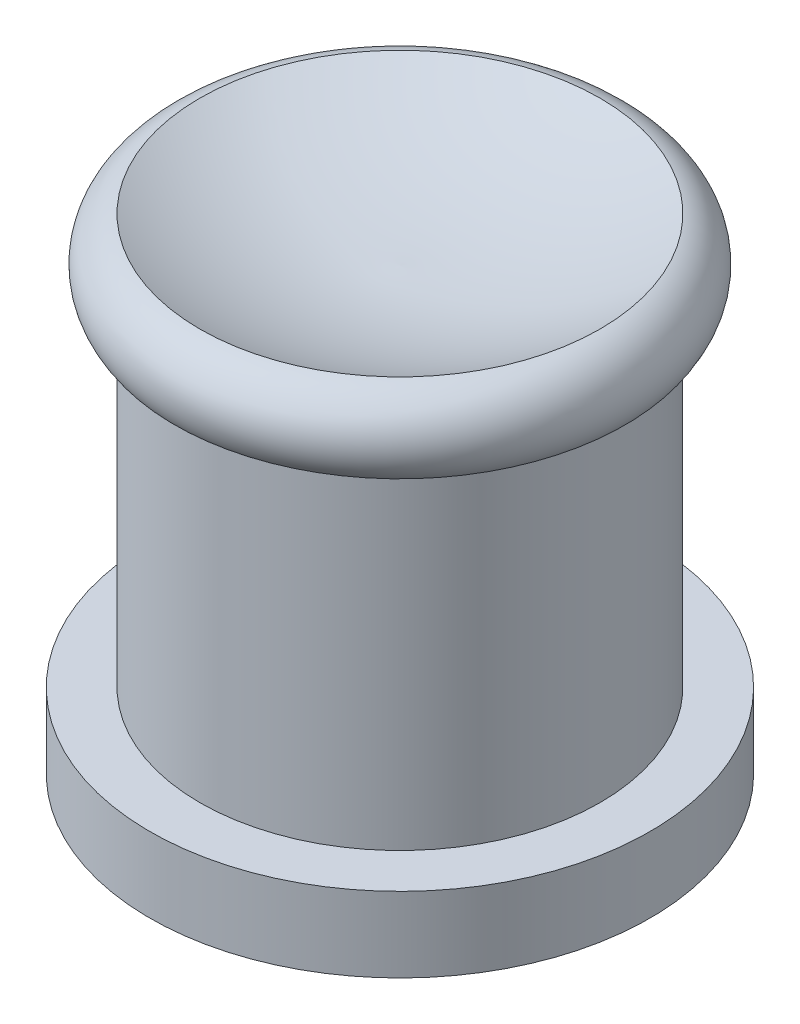
ISO-10303-21;
HEADER;
FILE_DESCRIPTION(('STEP AP214'),'2;1');
FILE_NAME('part.step','',(''),(''),'','','');
FILE_SCHEMA(('AUTOMOTIVE_DESIGN { 1 0 10303 214 1 1 1 1 }'));
ENDSEC;
DATA;
#1=APPLICATION_CONTEXT('core data for automotive mechanical design processes');
#2=APPLICATION_PROTOCOL_DEFINITION('international standard','automotive_design',2000,#1);
#3=PRODUCT_CONTEXT('',#1,'mechanical');
#4=PRODUCT('Part','Part','',(#3));
#5=PRODUCT_RELATED_PRODUCT_CATEGORY('part','',(#4));
#6=PRODUCT_DEFINITION_FORMATION('','',#4);
#7=PRODUCT_DEFINITION_CONTEXT('part definition',#1,'design');
#8=PRODUCT_DEFINITION('design','',#6,#7);
#9=PRODUCT_DEFINITION_SHAPE('','',#8);
#10=(LENGTH_UNIT() NAMED_UNIT(*) SI_UNIT(.MILLI.,.METRE.));
#11=(NAMED_UNIT(*) PLANE_ANGLE_UNIT() SI_UNIT($,.RADIAN.));
#12=(NAMED_UNIT(*) SI_UNIT($,.STERADIAN.) SOLID_ANGLE_UNIT());
#13=UNCERTAINTY_MEASURE_WITH_UNIT(LENGTH_MEASURE(1.E-05),#10,'distance_accuracy_value','');
#14=(GEOMETRIC_REPRESENTATION_CONTEXT(3) GLOBAL_UNCERTAINTY_ASSIGNED_CONTEXT((#13)) GLOBAL_UNIT_ASSIGNED_CONTEXT((#10,
#11,#12)) REPRESENTATION_CONTEXT('',''));
#15=CARTESIAN_POINT('',(0.,0.,0.));
#16=DIRECTION('',(0.,0.,1.));
#17=DIRECTION('',(1.,0.,0.));
#18=AXIS2_PLACEMENT_3D('',#15,#16,#17);
#19=CARTESIAN_POINT('',(0.,0.,0.));
#20=DIRECTION('',(0.,1.,0.));
#21=DIRECTION('',(-1.,0.,0.));
#22=AXIS2_PLACEMENT_3D('',#19,#20,#21);
#23=PLANE('',#22);
#24=CARTESIAN_POINT('',(0.,0.,0.));
#25=DIRECTION('',(0.,1.,0.));
#26=DIRECTION('',(-1.,0.,0.));
#27=AXIS2_PLACEMENT_3D('',#24,#25,#26);
#28=CIRCLE('',#27,0.5);
#29=CARTESIAN_POINT('',(-0.5,0.,0.));
#30=VERTEX_POINT('',#29);
#31=EDGE_CURVE('E11',#30,#30,#28,.T.);
#32=ORIENTED_EDGE('',*,*,#31,.F.);
#33=EDGE_LOOP('',(#32));
#34=FACE_BOUND('',#33,.T.);
#35=ADVANCED_FACE('F32',(#34),#23,.F.);
#36=CARTESIAN_POINT('',(0.,0.88,0.));
#37=DIRECTION('',(0.,1.,0.));
#38=DIRECTION('',(-1.,0.,0.));
#39=AXIS2_PLACEMENT_3D('',#36,#37,#38);
#40=CYLINDRICAL_SURFACE('',#39,0.5);
#41=CARTESIAN_POINT('',(0.,0.15,0.));
#42=DIRECTION('',(0.,1.,0.));
#43=DIRECTION('',(-1.,0.,0.));
#44=AXIS2_PLACEMENT_3D('',#41,#42,#43);
#45=CIRCLE('',#44,0.5);
#46=CARTESIAN_POINT('',(-0.5,0.15,0.));
#47=VERTEX_POINT('',#46);
#48=EDGE_CURVE('E38',#47,#47,#45,.T.);
#49=ORIENTED_EDGE('',*,*,#48,.F.);
#50=EDGE_LOOP('',(#49));
#51=FACE_BOUND('',#50,.T.);
#52=ORIENTED_EDGE('',*,*,#31,.T.);
#53=EDGE_LOOP('',(#52));
#54=FACE_BOUND('',#53,.T.);
#55=ADVANCED_FACE('F65',(#51,#54),#40,.T.);
#56=CARTESIAN_POINT('',(0.5,0.15,0.));
#57=DIRECTION('',(0.,-1.,0.));
#58=DIRECTION('',(1.,0.,0.));
#59=AXIS2_PLACEMENT_3D('',#56,#57,#58);
#60=PLANE('',#59);
#61=CARTESIAN_POINT('',(0.,0.15,0.));
#62=DIRECTION('',(0.,1.,0.));
#63=DIRECTION('',(-1.,0.,0.));
#64=AXIS2_PLACEMENT_3D('',#61,#62,#63);
#65=CIRCLE('',#64,0.4);
#66=CARTESIAN_POINT('',(-0.4,0.15,0.));
#67=VERTEX_POINT('',#66);
#68=EDGE_CURVE('E58',#67,#67,#65,.T.);
#69=ORIENTED_EDGE('',*,*,#68,.F.);
#70=EDGE_LOOP('',(#69));
#71=FACE_BOUND('',#70,.T.);
#72=ORIENTED_EDGE('',*,*,#48,.T.);
#73=EDGE_LOOP('',(#72));
#74=FACE_BOUND('',#73,.T.);
#75=ADVANCED_FACE('F63',(#71,#74),#60,.F.);
#76=CARTESIAN_POINT('',(0.,0.88,0.));
#77=DIRECTION('',(0.,1.,0.));
#78=DIRECTION('',(-1.,0.,0.));
#79=AXIS2_PLACEMENT_3D('',#76,#77,#78);
#80=CYLINDRICAL_SURFACE('',#79,0.4);
#81=CARTESIAN_POINT('',(0.,0.8,0.));
#82=DIRECTION('',(0.,1.,0.));
#83=DIRECTION('',(-1.,0.,0.));
#84=AXIS2_PLACEMENT_3D('',#81,#82,#83);
#85=CIRCLE('',#84,0.4);
#86=CARTESIAN_POINT('',(-0.400000000000001,0.8,0.));
#87=VERTEX_POINT('',#86);
#88=EDGE_CURVE('E53',#87,#87,#85,.T.);
#89=ORIENTED_EDGE('',*,*,#88,.F.);
#90=EDGE_LOOP('',(#89));
#91=FACE_BOUND('',#90,.T.);
#92=ORIENTED_EDGE('',*,*,#68,.T.);
#93=EDGE_LOOP('',(#92));
#94=FACE_BOUND('',#93,.T.);
#95=ADVANCED_FACE('F83',(#91,#94),#80,.T.);
#96=CARTESIAN_POINT('',(0.,0.8,0.));
#97=DIRECTION('',(0.,1.,0.));
#98=DIRECTION('',(-1.,0.,0.));
#99=AXIS2_PLACEMENT_3D('',#96,#97,#98);
#100=CONICAL_SURFACE('',#99,0.4,1.0471975511966);
#101=CARTESIAN_POINT('',(0.,0.828867513459481,0.));
#102=DIRECTION('',(0.,1.,0.));
#103=DIRECTION('',(-1.,0.,0.));
#104=AXIS2_PLACEMENT_3D('',#101,#102,#103);
#105=CIRCLE('',#104,0.45);
#106=CARTESIAN_POINT('',(-0.450000000000001,0.828867513459481,0.));
#107=VERTEX_POINT('',#106);
#108=EDGE_CURVE('E50',#107,#107,#105,.T.);
#109=ORIENTED_EDGE('',*,*,#108,.F.);
#110=EDGE_LOOP('',(#109));
#111=FACE_BOUND('',#110,.T.);
#112=ORIENTED_EDGE('',*,*,#88,.T.);
#113=EDGE_LOOP('',(#112));
#114=FACE_BOUND('',#113,.T.);
#115=ADVANCED_FACE('F91',(#111,#114),#100,.T.);
#116=CARTESIAN_POINT('',(0.,0.882752128019087,0.));
#117=DIRECTION('',(0.,1.,0.));
#118=DIRECTION('',(-1.,0.,0.));
#119=AXIS2_PLACEMENT_3D('',#116,#117,#118);
#120=TOROIDAL_SURFACE('',#119,0.377913605210396,0.09);
#121=CARTESIAN_POINT('',(0.,0.97,0.));
#122=DIRECTION('',(0.,1.,0.));
#123=DIRECTION('',(-1.,0.,0.));
#124=AXIS2_PLACEMENT_3D('',#121,#122,#123);
#125=CIRCLE('',#124,0.4);
#126=CARTESIAN_POINT('',(-0.4,0.97,0.));
#127=VERTEX_POINT('',#126);
#128=EDGE_CURVE('E48',#127,#127,#125,.T.);
#129=ORIENTED_EDGE('',*,*,#128,.F.);
#130=EDGE_LOOP('',(#129));
#131=FACE_BOUND('',#130,.T.);
#132=ORIENTED_EDGE('',*,*,#108,.T.);
#133=EDGE_LOOP('',(#132));
#134=FACE_BOUND('',#133,.T.);
#135=ADVANCED_FACE('F44',(#131,#134),#120,.T.);
#136=CARTESIAN_POINT('',(-0.0302537586965637,1.67942773912639,0.));
#137=DIRECTION('',(0.,0.,-1.));
#138=DIRECTION('',(-1.,0.,0.));
#139=AXIS2_PLACEMENT_3D('',#136,#137,#138);
#140=CIRCLE('',#139,0.8);
#141=TRIMMED_CURVE('',#140,(PARAMETER_VALUE(-1.60862254495606)),
(PARAMETER_VALUE(1.60862254495606)),.T.,.PARAMETER.);
#142=CARTESIAN_POINT('',(0.,1.67942773912639,0.));
#143=DIRECTION('',(0.,1.,0.));
#144=AXIS1_PLACEMENT('',#142,#143);
#145=SURFACE_OF_REVOLUTION('',#141,#144);
#146=CARTESIAN_POINT('',(0.,0.88,0.));
#147=VERTEX_POINT('',#146);
#148=VERTEX_LOOP('',#147);
#149=FACE_BOUND('',#148,.T.);
#150=ORIENTED_EDGE('',*,*,#128,.T.);
#151=EDGE_LOOP('',(#150));
#152=FACE_BOUND('',#151,.T.);
#153=ADVANCED_FACE('F41',(#149,#152),#145,.F.);
#154=CLOSED_SHELL('',(#35,#55,#75,#95,#115,#135,#153));
#155=MANIFOLD_SOLID_BREP('B2',#154);
#156=ADVANCED_BREP_SHAPE_REPRESENTATION('',(#18,#155),#14);
#157=SHAPE_DEFINITION_REPRESENTATION(#9,#156);
ENDSEC;
END-ISO-10303-21;
